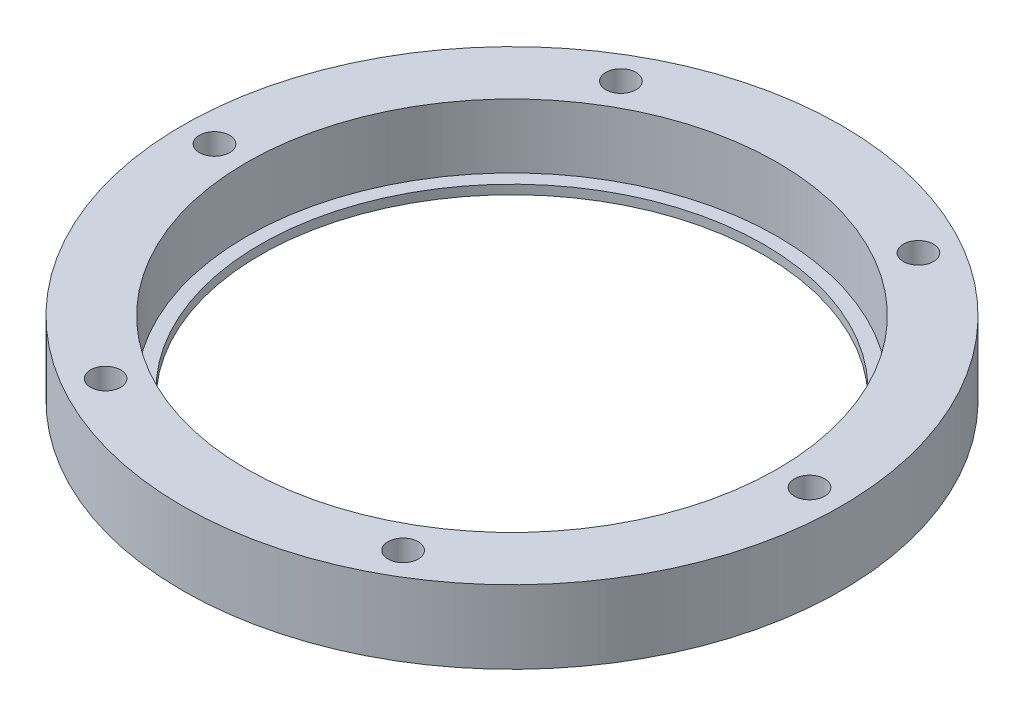
ISO-10303-21;
HEADER;
FILE_DESCRIPTION(('STEP AP214'),'2;1');
FILE_NAME('part.step','',(''),(''),'','','');
FILE_SCHEMA(('AUTOMOTIVE_DESIGN { 1 0 10303 214 1 1 1 1 }'));
ENDSEC;
DATA;
#1=APPLICATION_CONTEXT('core data for automotive mechanical design processes');
#2=APPLICATION_PROTOCOL_DEFINITION('international standard','automotive_design',2000,#1);
#3=PRODUCT_CONTEXT('',#1,'mechanical');
#4=PRODUCT('Part','Part','',(#3));
#5=PRODUCT_RELATED_PRODUCT_CATEGORY('part','',(#4));
#6=PRODUCT_DEFINITION_FORMATION('','',#4);
#7=PRODUCT_DEFINITION_CONTEXT('part definition',#1,'design');
#8=PRODUCT_DEFINITION('design','',#6,#7);
#9=PRODUCT_DEFINITION_SHAPE('','',#8);
#10=(LENGTH_UNIT() NAMED_UNIT(*) SI_UNIT(.MILLI.,.METRE.));
#11=(NAMED_UNIT(*) PLANE_ANGLE_UNIT() SI_UNIT($,.RADIAN.));
#12=(NAMED_UNIT(*) SI_UNIT($,.STERADIAN.) SOLID_ANGLE_UNIT());
#13=UNCERTAINTY_MEASURE_WITH_UNIT(LENGTH_MEASURE(1.E-05),#10,'distance_accuracy_value','');
#14=(GEOMETRIC_REPRESENTATION_CONTEXT(3) GLOBAL_UNCERTAINTY_ASSIGNED_CONTEXT((#13)) GLOBAL_UNIT_ASSIGNED_CONTEXT((#10,
#11,#12)) REPRESENTATION_CONTEXT('',''));
#15=CARTESIAN_POINT('',(0.,0.,0.));
#16=DIRECTION('',(0.,0.,1.));
#17=DIRECTION('',(1.,0.,0.));
#18=AXIS2_PLACEMENT_3D('',#15,#16,#17);
#19=CARTESIAN_POINT('',(0.,7.,0.));
#20=DIRECTION('',(0.,1.,0.));
#21=DIRECTION('',(0.,0.,1.));
#22=AXIS2_PLACEMENT_3D('',#19,#20,#21);
#23=PLANE('',#22);
#24=CARTESIAN_POINT('',(-16.25,7.,-28.1458256229943));
#25=DIRECTION('',(0.,1.,0.));
#26=DIRECTION('',(0.,0.,1.));
#27=AXIS2_PLACEMENT_3D('',#24,#25,#26);
#28=CIRCLE('',#27,1.64999999999999);
#29=CARTESIAN_POINT('',(-16.25,7.,-26.4958256229943));
#30=VERTEX_POINT('',#29);
#31=EDGE_CURVE('E92',#30,#30,#28,.T.);
#32=ORIENTED_EDGE('',*,*,#31,.F.);
#33=EDGE_LOOP('',(#32));
#34=FACE_BOUND('',#33,.T.);
#35=CARTESIAN_POINT('',(16.25,7.,-28.1458256229943));
#36=DIRECTION('',(0.,1.,0.));
#37=DIRECTION('',(0.,0.,1.));
#38=AXIS2_PLACEMENT_3D('',#35,#36,#37);
#39=CIRCLE('',#38,1.64999999999999);
#40=CARTESIAN_POINT('',(16.25,7.,-26.4958256229943));
#41=VERTEX_POINT('',#40);
#42=EDGE_CURVE('E86',#41,#41,#39,.T.);
#43=ORIENTED_EDGE('',*,*,#42,.F.);
#44=EDGE_LOOP('',(#43));
#45=FACE_BOUND('',#44,.T.);
#46=CARTESIAN_POINT('',(32.5,7.,0.));
#47=DIRECTION('',(0.,1.,0.));
#48=DIRECTION('',(0.,0.,1.));
#49=AXIS2_PLACEMENT_3D('',#46,#47,#48);
#50=CIRCLE('',#49,1.64999999999999);
#51=CARTESIAN_POINT('',(32.5,7.,1.64999999999998));
#52=VERTEX_POINT('',#51);
#53=EDGE_CURVE('E80',#52,#52,#50,.T.);
#54=ORIENTED_EDGE('',*,*,#53,.F.);
#55=EDGE_LOOP('',(#54));
#56=FACE_BOUND('',#55,.T.);
#57=CARTESIAN_POINT('',(16.25,7.,28.1458256229943));
#58=DIRECTION('',(0.,1.,0.));
#59=DIRECTION('',(0.,0.,1.));
#60=AXIS2_PLACEMENT_3D('',#57,#58,#59);
#61=CIRCLE('',#60,1.64999999999999);
#62=CARTESIAN_POINT('',(16.25,7.,29.7958256229942));
#63=VERTEX_POINT('',#62);
#64=EDGE_CURVE('E74',#63,#63,#61,.T.);
#65=ORIENTED_EDGE('',*,*,#64,.F.);
#66=EDGE_LOOP('',(#65));
#67=FACE_BOUND('',#66,.T.);
#68=CARTESIAN_POINT('',(-16.25,7.,28.1458256229943));
#69=DIRECTION('',(0.,1.,0.));
#70=DIRECTION('',(0.,0.,1.));
#71=AXIS2_PLACEMENT_3D('',#68,#69,#70);
#72=CIRCLE('',#71,1.64999999999999);
#73=CARTESIAN_POINT('',(-16.25,7.,29.7958256229943));
#74=VERTEX_POINT('',#73);
#75=EDGE_CURVE('E68',#74,#74,#72,.T.);
#76=ORIENTED_EDGE('',*,*,#75,.F.);
#77=EDGE_LOOP('',(#76));
#78=FACE_BOUND('',#77,.T.);
#79=CARTESIAN_POINT('',(-32.5,7.,0.));
#80=DIRECTION('',(0.,1.,0.));
#81=DIRECTION('',(0.,0.,1.));
#82=AXIS2_PLACEMENT_3D('',#79,#80,#81);
#83=CIRCLE('',#82,1.64999999999999);
#84=CARTESIAN_POINT('',(-32.5,7.,1.64999999999998));
#85=VERTEX_POINT('',#84);
#86=EDGE_CURVE('E62',#85,#85,#83,.T.);
#87=ORIENTED_EDGE('',*,*,#86,.F.);
#88=EDGE_LOOP('',(#87));
#89=FACE_BOUND('',#88,.T.);
#90=CARTESIAN_POINT('',(0.,7.,0.));
#91=DIRECTION('',(0.,1.,0.));
#92=DIRECTION('',(0.,0.,1.));
#93=AXIS2_PLACEMENT_3D('',#90,#91,#92);
#94=CIRCLE('',#93,36.);
#95=CARTESIAN_POINT('',(0.,7.,36.));
#96=VERTEX_POINT('',#95);
#97=EDGE_CURVE('E10',#96,#96,#94,.T.);
#98=ORIENTED_EDGE('',*,*,#97,.T.);
#99=EDGE_LOOP('',(#98));
#100=FACE_BOUND('',#99,.T.);
#101=CARTESIAN_POINT('',(0.,7.,0.));
#102=DIRECTION('',(0.,1.,0.));
#103=DIRECTION('',(0.,0.,1.));
#104=AXIS2_PLACEMENT_3D('',#101,#102,#103);
#105=CIRCLE('',#104,29.);
#106=CARTESIAN_POINT('',(0.,7.,29.));
#107=VERTEX_POINT('',#106);
#108=EDGE_CURVE('E40',#107,#107,#105,.T.);
#109=ORIENTED_EDGE('',*,*,#108,.F.);
#110=EDGE_LOOP('',(#109));
#111=FACE_BOUND('',#110,.T.);
#112=ADVANCED_FACE('F33',(#34,#45,#56,#67,#78,#89,#100,#111),#23,.T.);
#113=CARTESIAN_POINT('',(0.,7.,0.));
#114=DIRECTION('',(0.,-1.,0.));
#115=DIRECTION('',(0.,0.,-1.));
#116=AXIS2_PLACEMENT_3D('',#113,#114,#115);
#117=CYLINDRICAL_SURFACE('',#116,36.);
#118=ORIENTED_EDGE('',*,*,#97,.F.);
#119=EDGE_LOOP('',(#118));
#120=FACE_BOUND('',#119,.T.);
#121=CARTESIAN_POINT('',(0.,-1.,0.));
#122=DIRECTION('',(0.,-1.,0.));
#123=DIRECTION('',(0.,0.,-1.));
#124=AXIS2_PLACEMENT_3D('',#121,#122,#123);
#125=CIRCLE('',#124,36.);
#126=CARTESIAN_POINT('',(0.,-1.,-36.));
#127=VERTEX_POINT('',#126);
#128=EDGE_CURVE('E49',#127,#127,#125,.T.);
#129=ORIENTED_EDGE('',*,*,#128,.F.);
#130=EDGE_LOOP('',(#129));
#131=FACE_BOUND('',#130,.T.);
#132=ADVANCED_FACE('F35',(#120,#131),#117,.T.);
#133=CARTESIAN_POINT('',(0.,7.,0.));
#134=DIRECTION('',(0.,-1.,0.));
#135=DIRECTION('',(0.,0.,-1.));
#136=AXIS2_PLACEMENT_3D('',#133,#134,#135);
#137=CYLINDRICAL_SURFACE('',#136,29.);
#138=ORIENTED_EDGE('',*,*,#108,.T.);
#139=EDGE_LOOP('',(#138));
#140=FACE_BOUND('',#139,.T.);
#141=CARTESIAN_POINT('',(0.,0.,0.));
#142=DIRECTION('',(0.,1.,0.));
#143=DIRECTION('',(0.,0.,1.));
#144=AXIS2_PLACEMENT_3D('',#141,#142,#143);
#145=CIRCLE('',#144,29.);
#146=CARTESIAN_POINT('',(0.,0.,29.));
#147=VERTEX_POINT('',#146);
#148=EDGE_CURVE('E44',#147,#147,#145,.T.);
#149=ORIENTED_EDGE('',*,*,#148,.F.);
#150=EDGE_LOOP('',(#149));
#151=FACE_BOUND('',#150,.T.);
#152=ADVANCED_FACE('F136',(#140,#151),#137,.F.);
#153=CARTESIAN_POINT('',(0.,0.,0.));
#154=DIRECTION('',(0.,-1.,0.));
#155=DIRECTION('',(0.,0.,-1.));
#156=AXIS2_PLACEMENT_3D('',#153,#154,#155);
#157=PLANE('',#156);
#158=CARTESIAN_POINT('',(0.,0.,0.));
#159=DIRECTION('',(0.,-1.,0.));
#160=DIRECTION('',(0.,0.,-1.));
#161=AXIS2_PLACEMENT_3D('',#158,#159,#160);
#162=CIRCLE('',#161,27.5);
#163=CARTESIAN_POINT('',(0.,0.,-27.5));
#164=VERTEX_POINT('',#163);
#165=EDGE_CURVE('E54',#164,#164,#162,.T.);
#166=ORIENTED_EDGE('',*,*,#165,.T.);
#167=EDGE_LOOP('',(#166));
#168=FACE_BOUND('',#167,.T.);
#169=ORIENTED_EDGE('',*,*,#148,.T.);
#170=EDGE_LOOP('',(#169));
#171=FACE_BOUND('',#170,.T.);
#172=ADVANCED_FACE('F132',(#168,#171),#157,.F.);
#173=CARTESIAN_POINT('',(0.,-1.,0.));
#174=DIRECTION('',(0.,-1.,0.));
#175=DIRECTION('',(0.,0.,-1.));
#176=AXIS2_PLACEMENT_3D('',#173,#174,#175);
#177=PLANE('',#176);
#178=CARTESIAN_POINT('',(-16.25,-1.,-28.1458256229943));
#179=DIRECTION('',(0.,1.,0.));
#180=DIRECTION('',(0.,0.,1.));
#181=AXIS2_PLACEMENT_3D('',#178,#179,#180);
#182=CIRCLE('',#181,1.65);
#183=CARTESIAN_POINT('',(-16.25,-1.,-26.4958256229943));
#184=VERTEX_POINT('',#183);
#185=EDGE_CURVE('E89',#184,#184,#182,.T.);
#186=ORIENTED_EDGE('',*,*,#185,.T.);
#187=EDGE_LOOP('',(#186));
#188=FACE_BOUND('',#187,.T.);
#189=CARTESIAN_POINT('',(16.25,-1.,-28.1458256229943));
#190=DIRECTION('',(0.,1.,0.));
#191=DIRECTION('',(0.,0.,1.));
#192=AXIS2_PLACEMENT_3D('',#189,#190,#191);
#193=CIRCLE('',#192,1.65);
#194=CARTESIAN_POINT('',(16.25,-1.,-26.4958256229943));
#195=VERTEX_POINT('',#194);
#196=EDGE_CURVE('E83',#195,#195,#193,.T.);
#197=ORIENTED_EDGE('',*,*,#196,.T.);
#198=EDGE_LOOP('',(#197));
#199=FACE_BOUND('',#198,.T.);
#200=CARTESIAN_POINT('',(32.5,-1.,0.));
#201=DIRECTION('',(0.,1.,0.));
#202=DIRECTION('',(0.,0.,1.));
#203=AXIS2_PLACEMENT_3D('',#200,#201,#202);
#204=CIRCLE('',#203,1.65);
#205=CARTESIAN_POINT('',(32.5,-1.,1.64999999999999));
#206=VERTEX_POINT('',#205);
#207=EDGE_CURVE('E77',#206,#206,#204,.T.);
#208=ORIENTED_EDGE('',*,*,#207,.T.);
#209=EDGE_LOOP('',(#208));
#210=FACE_BOUND('',#209,.T.);
#211=CARTESIAN_POINT('',(16.25,-1.,28.1458256229943));
#212=DIRECTION('',(0.,1.,0.));
#213=DIRECTION('',(0.,0.,1.));
#214=AXIS2_PLACEMENT_3D('',#211,#212,#213);
#215=CIRCLE('',#214,1.65);
#216=CARTESIAN_POINT('',(16.25,-1.,29.7958256229943));
#217=VERTEX_POINT('',#216);
#218=EDGE_CURVE('E71',#217,#217,#215,.T.);
#219=ORIENTED_EDGE('',*,*,#218,.T.);
#220=EDGE_LOOP('',(#219));
#221=FACE_BOUND('',#220,.T.);
#222=CARTESIAN_POINT('',(-16.25,-1.,28.1458256229943));
#223=DIRECTION('',(0.,1.,0.));
#224=DIRECTION('',(0.,0.,1.));
#225=AXIS2_PLACEMENT_3D('',#222,#223,#224);
#226=CIRCLE('',#225,1.65);
#227=CARTESIAN_POINT('',(-16.25,-1.,29.7958256229943));
#228=VERTEX_POINT('',#227);
#229=EDGE_CURVE('E65',#228,#228,#226,.T.);
#230=ORIENTED_EDGE('',*,*,#229,.T.);
#231=EDGE_LOOP('',(#230));
#232=FACE_BOUND('',#231,.T.);
#233=CARTESIAN_POINT('',(-32.5,-1.,0.));
#234=DIRECTION('',(0.,1.,0.));
#235=DIRECTION('',(0.,0.,1.));
#236=AXIS2_PLACEMENT_3D('',#233,#234,#235);
#237=CIRCLE('',#236,1.65);
#238=CARTESIAN_POINT('',(-32.5,-1.,1.65));
#239=VERTEX_POINT('',#238);
#240=EDGE_CURVE('E57',#239,#239,#237,.T.);
#241=ORIENTED_EDGE('',*,*,#240,.T.);
#242=EDGE_LOOP('',(#241));
#243=FACE_BOUND('',#242,.T.);
#244=ORIENTED_EDGE('',*,*,#128,.T.);
#245=EDGE_LOOP('',(#244));
#246=FACE_BOUND('',#245,.T.);
#247=CARTESIAN_POINT('',(0.,-1.,0.));
#248=DIRECTION('',(0.,-1.,0.));
#249=DIRECTION('',(0.,0.,-1.));
#250=AXIS2_PLACEMENT_3D('',#247,#248,#249);
#251=CIRCLE('',#250,27.5);
#252=CARTESIAN_POINT('',(0.,-1.,-27.5));
#253=VERTEX_POINT('',#252);
#254=EDGE_CURVE('E53',#253,#253,#251,.T.);
#255=ORIENTED_EDGE('',*,*,#254,.F.);
#256=EDGE_LOOP('',(#255));
#257=FACE_BOUND('',#256,.T.);
#258=ADVANCED_FACE('F124',(#188,#199,#210,#221,#232,#243,#246,#257),#177,.T.);
#259=CARTESIAN_POINT('',(0.,-1.,0.));
#260=DIRECTION('',(0.,1.,0.));
#261=DIRECTION('',(0.,0.,1.));
#262=AXIS2_PLACEMENT_3D('',#259,#260,#261);
#263=CYLINDRICAL_SURFACE('',#262,27.5);
#264=ORIENTED_EDGE('',*,*,#254,.T.);
#265=EDGE_LOOP('',(#264));
#266=FACE_BOUND('',#265,.T.);
#267=ORIENTED_EDGE('',*,*,#165,.F.);
#268=EDGE_LOOP('',(#267));
#269=FACE_BOUND('',#268,.T.);
#270=ADVANCED_FACE('F114',(#266,#269),#263,.F.);
#271=CARTESIAN_POINT('',(-32.5,7.,0.));
#272=DIRECTION('',(0.,1.,0.));
#273=DIRECTION('',(0.,0.,1.));
#274=AXIS2_PLACEMENT_3D('',#271,#272,#273);
#275=CYLINDRICAL_SURFACE('',#274,1.64999999999999);
#276=ORIENTED_EDGE('',*,*,#240,.F.);
#277=EDGE_LOOP('',(#276));
#278=FACE_BOUND('',#277,.T.);
#279=ORIENTED_EDGE('',*,*,#86,.T.);
#280=EDGE_LOOP('',(#279));
#281=FACE_BOUND('',#280,.T.);
#282=ADVANCED_FACE('F111',(#278,#281),#275,.F.);
#283=CARTESIAN_POINT('',(-16.25,7.,28.1458256229943));
#284=DIRECTION('',(0.,1.,0.));
#285=DIRECTION('',(0.,0.,1.));
#286=AXIS2_PLACEMENT_3D('',#283,#284,#285);
#287=CYLINDRICAL_SURFACE('',#286,1.64999999999999);
#288=ORIENTED_EDGE('',*,*,#229,.F.);
#289=EDGE_LOOP('',(#288));
#290=FACE_BOUND('',#289,.T.);
#291=ORIENTED_EDGE('',*,*,#75,.T.);
#292=EDGE_LOOP('',(#291));
#293=FACE_BOUND('',#292,.T.);
#294=ADVANCED_FACE('F113',(#290,#293),#287,.F.);
#295=CARTESIAN_POINT('',(16.25,7.,28.1458256229943));
#296=DIRECTION('',(0.,1.,0.));
#297=DIRECTION('',(0.,0.,1.));
#298=AXIS2_PLACEMENT_3D('',#295,#296,#297);
#299=CYLINDRICAL_SURFACE('',#298,1.64999999999999);
#300=ORIENTED_EDGE('',*,*,#218,.F.);
#301=EDGE_LOOP('',(#300));
#302=FACE_BOUND('',#301,.T.);
#303=ORIENTED_EDGE('',*,*,#64,.T.);
#304=EDGE_LOOP('',(#303));
#305=FACE_BOUND('',#304,.T.);
#306=ADVANCED_FACE('F121',(#302,#305),#299,.F.);
#307=CARTESIAN_POINT('',(32.5,7.,0.));
#308=DIRECTION('',(0.,1.,0.));
#309=DIRECTION('',(0.,0.,1.));
#310=AXIS2_PLACEMENT_3D('',#307,#308,#309);
#311=CYLINDRICAL_SURFACE('',#310,1.65);
#312=ORIENTED_EDGE('',*,*,#207,.F.);
#313=EDGE_LOOP('',(#312));
#314=FACE_BOUND('',#313,.T.);
#315=ORIENTED_EDGE('',*,*,#53,.T.);
#316=EDGE_LOOP('',(#315));
#317=FACE_BOUND('',#316,.T.);
#318=ADVANCED_FACE('F194',(#314,#317),#311,.F.);
#319=CARTESIAN_POINT('',(16.25,7.,-28.1458256229943));
#320=DIRECTION('',(0.,1.,0.));
#321=DIRECTION('',(0.,0.,1.));
#322=AXIS2_PLACEMENT_3D('',#319,#320,#321);
#323=CYLINDRICAL_SURFACE('',#322,1.64999999999999);
#324=ORIENTED_EDGE('',*,*,#196,.F.);
#325=EDGE_LOOP('',(#324));
#326=FACE_BOUND('',#325,.T.);
#327=ORIENTED_EDGE('',*,*,#42,.T.);
#328=EDGE_LOOP('',(#327));
#329=FACE_BOUND('',#328,.T.);
#330=ADVANCED_FACE('F205',(#326,#329),#323,.F.);
#331=CARTESIAN_POINT('',(-16.25,7.,-28.1458256229943));
#332=DIRECTION('',(0.,1.,0.));
#333=DIRECTION('',(0.,0.,1.));
#334=AXIS2_PLACEMENT_3D('',#331,#332,#333);
#335=CYLINDRICAL_SURFACE('',#334,1.64999999999999);
#336=ORIENTED_EDGE('',*,*,#185,.F.);
#337=EDGE_LOOP('',(#336));
#338=FACE_BOUND('',#337,.T.);
#339=ORIENTED_EDGE('',*,*,#31,.T.);
#340=EDGE_LOOP('',(#339));
#341=FACE_BOUND('',#340,.T.);
#342=ADVANCED_FACE('F96',(#338,#341),#335,.F.);
#343=CLOSED_SHELL('',(#112,#132,#152,#172,#258,#270,#282,#294,#306,#318,#330,#342));
#344=MANIFOLD_SOLID_BREP('B2',#343);
#345=ADVANCED_BREP_SHAPE_REPRESENTATION('',(#18,#344),#14);
#346=SHAPE_DEFINITION_REPRESENTATION(#9,#345);
ENDSEC;
END-ISO-10303-21;
